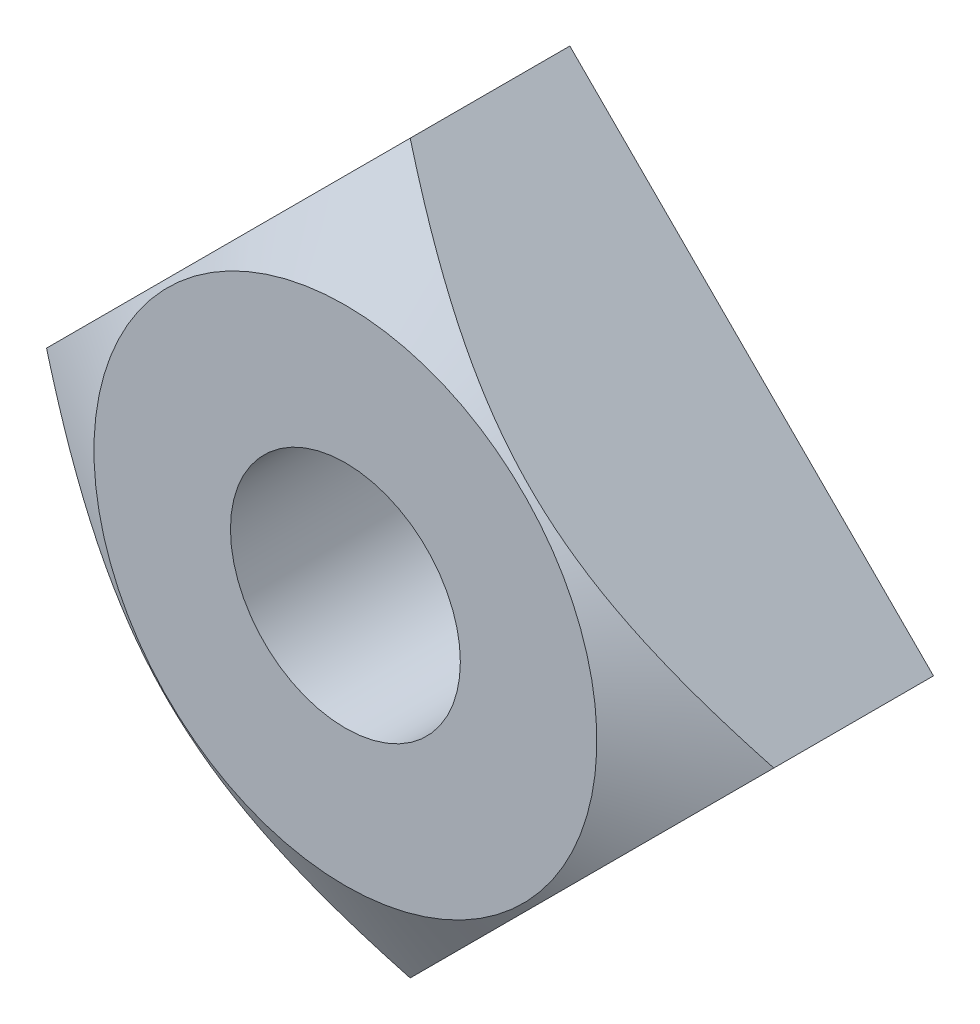
ISO-10303-21;
HEADER;
FILE_DESCRIPTION(('STEP AP214'),'2;1');
FILE_NAME('part.step','',(''),(''),'','','');
FILE_SCHEMA(('AUTOMOTIVE_DESIGN { 1 0 10303 214 1 1 1 1 }'));
ENDSEC;
DATA;
#1=APPLICATION_CONTEXT('core data for automotive mechanical design processes');
#2=APPLICATION_PROTOCOL_DEFINITION('international standard','automotive_design',2000,#1);
#3=PRODUCT_CONTEXT('',#1,'mechanical');
#4=PRODUCT('Part','Part','',(#3));
#5=PRODUCT_RELATED_PRODUCT_CATEGORY('part','',(#4));
#6=PRODUCT_DEFINITION_FORMATION('','',#4);
#7=PRODUCT_DEFINITION_CONTEXT('part definition',#1,'design');
#8=PRODUCT_DEFINITION('design','',#6,#7);
#9=PRODUCT_DEFINITION_SHAPE('','',#8);
#10=(LENGTH_UNIT() NAMED_UNIT(*) SI_UNIT(.MILLI.,.METRE.));
#11=(NAMED_UNIT(*) PLANE_ANGLE_UNIT() SI_UNIT($,.RADIAN.));
#12=(NAMED_UNIT(*) SI_UNIT($,.STERADIAN.) SOLID_ANGLE_UNIT());
#13=UNCERTAINTY_MEASURE_WITH_UNIT(LENGTH_MEASURE(1.E-05),#10,'distance_accuracy_value','');
#14=(GEOMETRIC_REPRESENTATION_CONTEXT(3) GLOBAL_UNCERTAINTY_ASSIGNED_CONTEXT((#13)) GLOBAL_UNIT_ASSIGNED_CONTEXT((#10,
#11,#12)) REPRESENTATION_CONTEXT('',''));
#15=CARTESIAN_POINT('',(0.,0.,0.));
#16=DIRECTION('',(0.,0.,1.));
#17=DIRECTION('',(1.,0.,0.));
#18=AXIS2_PLACEMENT_3D('',#15,#16,#17);
#19=CARTESIAN_POINT('',(-3.88908729652602,0.,-2.4));
#20=DIRECTION('',(-0.707106781186546,-0.707106781186549,0.));
#21=DIRECTION('',(0.707106781186549,-0.707106781186546,0.));
#22=AXIS2_PLACEMENT_3D('',#19,#20,#21);
#23=PLANE('',#22);
#24=DIRECTION('',(0.,0.,1.));
#25=VECTOR('',#24,1.);
#26=CARTESIAN_POINT('',(0.,-3.889087296526,-2.4));
#27=LINE('',#26,#25);
#28=CARTESIAN_POINT('',(0.,-3.889087296526,-2.4));
#29=VERTEX_POINT('',#28);
#30=CARTESIAN_POINT('',(0.,-3.889087296526,-0.692820323027553));
#31=VERTEX_POINT('',#30);
#32=EDGE_CURVE('E41',#29,#31,#27,.T.);
#33=ORIENTED_EDGE('',*,*,#32,.T.);
#34=CARTESIAN_POINT('',(0.000199999999998822,-3.889287296526,-0.692935796050317));
#35=CARTESIAN_POINT('',(-0.0659263686429715,-3.82316092788303,-0.654769628254131));
#36=CARTESIAN_POINT('',(-0.132291660917733,-3.75679563560827,-0.617412156509894));
#37=CARTESIAN_POINT('',(-0.265593268659043,-3.62349402786696,-0.544697309160815));
#38=CARTESIAN_POINT('',(-0.332529774496878,-3.55655752202913,-0.509340632925875));
#39=CARTESIAN_POINT('',(-0.467435999372075,-3.42165129715393,-0.440826454762846));
#40=CARTESIAN_POINT('',(-0.535409545003979,-3.35367775152203,-0.407683866054667));
#41=CARTESIAN_POINT('',(-0.672030025548941,-3.21705727097707,-0.344360491034057));
#42=CARTESIAN_POINT('',(-0.740676902842445,-3.14841039368356,-0.3141794536811));
#43=CARTESIAN_POINT('',(-0.945414957981738,-2.94367233854427,-0.229918968836834));
#44=CARTESIAN_POINT('',(-1.08261385766827,-2.80647343885774,-0.180909473833818));
#45=CARTESIAN_POINT('',(-1.29029020865001,-2.598797087876,-0.121791602560178));
#46=CARTESIAN_POINT('',(-1.3597548746417,-2.52933242188431,-0.104495655400296));
#47=CARTESIAN_POINT('',(-1.49925722442029,-2.38983007210572,-0.0753343842892979));
#48=CARTESIAN_POINT('',(-1.56929484546832,-2.31979245105769,-0.0634684736385099));
#49=CARTESIAN_POINT('',(-1.69827950347153,-2.19080779305448,-0.0471473001294974));
#50=CARTESIAN_POINT('',(-1.75717029316965,-2.13191700335636,-0.0417984092220668));
#51=CARTESIAN_POINT('',(-1.87507521153319,-2.01401208499282,-0.0354548013045492));
#52=CARTESIAN_POINT('',(-1.9340893482994,-1.95499794822662,-0.0344603798756705));
#53=CARTESIAN_POINT('',(-2.05209242713156,-1.83699486939445,-0.0368650112980426));
#54=CARTESIAN_POINT('',(-2.11108135434689,-1.77800594217913,-0.0402655216107517));
#55=CARTESIAN_POINT('',(-2.22886166442294,-1.66022563210307,-0.0513371041161467));
#56=CARTESIAN_POINT('',(-2.2876530182561,-1.60143427826992,-0.0590087784115486));
#57=CARTESIAN_POINT('',(-2.46371017532186,-1.42537712120415,-0.0881039990611984));
#58=CARTESIAN_POINT('',(-2.5804869139795,-1.30860038254651,-0.115603056450006));
#59=CARTESIAN_POINT('',(-2.812052084313,-1.07703521221302,-0.18375123296372));
#60=CARTESIAN_POINT('',(-2.92684004800507,-0.962247248520943,-0.224403404067461));
#61=CARTESIAN_POINT('',(-3.11299498612288,-0.77609231040314,-0.29904165671441));
#62=CARTESIAN_POINT('',(-3.18496978573453,-0.704117510791484,-0.330074532880308));
#63=CARTESIAN_POINT('',(-3.32813756425119,-0.560949732274827,-0.395455515419264));
#64=CARTESIAN_POINT('',(-3.39933077088909,-0.489756525636931,-0.4298026259449));
#65=CARTESIAN_POINT('',(-3.54066156164199,-0.34842573488403,-0.501030636719829));
#66=CARTESIAN_POINT('',(-3.6108026950012,-0.278284601524821,-0.537897567925962));
#67=CARTESIAN_POINT('',(-3.75047934906175,-0.138607947464268,-0.613860197792175));
#68=CARTESIAN_POINT('',(-3.82001487653742,-0.0690724199886025,-0.652955871484478));
#69=CARTESIAN_POINT('',(-3.889287296526,0.000199999999981001,-0.692935796050317));
#70=B_SPLINE_CURVE_WITH_KNOTS('',3,(#34,#35,#36,#37,#38,#39,#40,#41,#42,#43,#44,#45,#46,#47,#48,
#49,#50,#51,#52,#53,#54,#55,#56,#57,#58,#59,#60,#61,#62,#63,#64,#65,#66,#67,#68,#69),
.UNSPECIFIED.,.F.,.F.,(4,2,2,2,2,2,2,2,2,2,2,2,2,2,2,2,2,4),(0.,0.3030217506998,
0.606148775336212,0.911145901019314,1.21611715077057,1.8156214916209,2.11474730017217,
2.41384078141336,2.66410107824203,2.91437836246599,3.16473866575139,3.41513427107661,
3.91665268935898,4.4182875608732,4.73747154706454,5.05655992306882,5.3740039933746,
5.69144450817053),.UNSPECIFIED.);
#71=CARTESIAN_POINT('',(-3.889087296526,0.,-0.692820323027553));
#72=VERTEX_POINT('',#71);
#73=EDGE_CURVE('E54',#31,#72,#70,.T.);
#74=ORIENTED_EDGE('',*,*,#73,.T.);
#75=DIRECTION('',(0.,0.,1.));
#76=VECTOR('',#75,1.);
#77=CARTESIAN_POINT('',(-3.88908729652602,0.,-2.4));
#78=LINE('',#77,#76);
#79=CARTESIAN_POINT('',(-3.88908729652602,0.,-2.4));
#80=VERTEX_POINT('',#79);
#81=EDGE_CURVE('E11',#80,#72,#78,.T.);
#82=ORIENTED_EDGE('',*,*,#81,.F.);
#83=DIRECTION('',(0.707106781186549,-0.707106781186546,0.));
#84=VECTOR('',#83,1.);
#85=CARTESIAN_POINT('',(-3.88908729652602,0.,-2.4));
#86=LINE('',#85,#84);
#87=EDGE_CURVE('E107',#80,#29,#86,.T.);
#88=ORIENTED_EDGE('',*,*,#87,.T.);
#89=EDGE_LOOP('',(#33,#74,#82,#88));
#90=FACE_BOUND('',#89,.T.);
#91=ADVANCED_FACE('F37',(#90),#23,.T.);
#92=CARTESIAN_POINT('',(-3.88908729652602,0.,-2.4));
#93=DIRECTION('',(-0.707106781186546,0.707106781186549,0.));
#94=DIRECTION('',(-0.707106781186549,-0.707106781186546,0.));
#95=AXIS2_PLACEMENT_3D('',#92,#93,#94);
#96=PLANE('',#95);
#97=ORIENTED_EDGE('',*,*,#81,.T.);
#98=CARTESIAN_POINT('',(-3.889287296526,-0.000199999999982893,-0.692935796050317));
#99=CARTESIAN_POINT('',(-3.82316092788303,0.0659263686429873,-0.654769628254131));
#100=CARTESIAN_POINT('',(-3.75679563560827,0.132291660917749,-0.617412156509894));
#101=CARTESIAN_POINT('',(-3.62349402786696,0.265593268659058,-0.544697309160815));
#102=CARTESIAN_POINT('',(-3.55655752202913,0.332529774496893,-0.509340632925875));
#103=CARTESIAN_POINT('',(-3.42165129715393,0.467435999372089,-0.440826454762846));
#104=CARTESIAN_POINT('',(-3.35367775152202,0.535409545003992,-0.407683866054667));
#105=CARTESIAN_POINT('',(-3.21705727097706,0.672030025548954,-0.344360491034057));
#106=CARTESIAN_POINT('',(-3.14841039368356,0.740676902842458,-0.3141794536811));
#107=CARTESIAN_POINT('',(-2.94367233854427,0.945414957981749,-0.229918968836833));
#108=CARTESIAN_POINT('',(-2.80647343885773,1.08261385766828,-0.180909473833818));
#109=CARTESIAN_POINT('',(-2.598797087876,1.29029020865002,-0.121791602560177));
#110=CARTESIAN_POINT('',(-2.5293324218843,1.35975487464171,-0.104495655400296));
#111=CARTESIAN_POINT('',(-2.38983007210572,1.4992572244203,-0.0753343842892976));
#112=CARTESIAN_POINT('',(-2.31979245105769,1.56929484546832,-0.0634684736385095));
#113=CARTESIAN_POINT('',(-2.19080779305447,1.69827950347154,-0.0471473001294972));
#114=CARTESIAN_POINT('',(-2.13191700335635,1.75717029316966,-0.0417984092220667));
#115=CARTESIAN_POINT('',(-2.01401208499281,1.8750752115332,-0.0354548013045489));
#116=CARTESIAN_POINT('',(-1.95499794822661,1.9340893482994,-0.0344603798756698));
#117=CARTESIAN_POINT('',(-1.83699486939444,2.05209242713157,-0.0368650112980418));
#118=CARTESIAN_POINT('',(-1.77800594217912,2.11108135434689,-0.0402655216107512));
#119=CARTESIAN_POINT('',(-1.66022563210307,2.22886166442294,-0.0513371041161462));
#120=CARTESIAN_POINT('',(-1.60143427826991,2.2876530182561,-0.0590087784115479));
#121=CARTESIAN_POINT('',(-1.42537712120414,2.46371017532187,-0.0881039990611972));
#122=CARTESIAN_POINT('',(-1.3086003825465,2.58048691397951,-0.115603056450005));
#123=CARTESIAN_POINT('',(-1.077035212213,2.812052084313,-0.183751232963719));
#124=CARTESIAN_POINT('',(-0.962247248520929,2.92684004800508,-0.22440340406746));
#125=CARTESIAN_POINT('',(-0.776092310403126,3.11299498612288,-0.299041656714409));
#126=CARTESIAN_POINT('',(-0.70411751079147,3.18496978573454,-0.330074532880307));
#127=CARTESIAN_POINT('',(-0.560949732274812,3.32813756425119,-0.395455515419264));
#128=CARTESIAN_POINT('',(-0.489756525636915,3.39933077088909,-0.429802625944899));
#129=CARTESIAN_POINT('',(-0.348425734884013,3.54066156164199,-0.501030636719829));
#130=CARTESIAN_POINT('',(-0.278284601524804,3.6108026950012,-0.537897567925962));
#131=CARTESIAN_POINT('',(-0.138607947464251,3.75047934906175,-0.613860197792175));
#132=CARTESIAN_POINT('',(-0.0690724199885851,3.82001487653742,-0.652955871484477));
#133=CARTESIAN_POINT('',(0.000199999999998877,3.889287296526,-0.692935796050317));
#134=B_SPLINE_CURVE_WITH_KNOTS('',3,(#98,#99,#100,#101,#102,#103,#104,#105,#106,#107,#108,#109,
#110,#111,#112,#113,#114,#115,#116,#117,#118,#119,#120,#121,#122,#123,#124,#125,#126,#127,#128,
#129,#130,#131,#132,#133),.UNSPECIFIED.,.F.,.F.,(4,2,2,2,2,2,2,2,2,2,2,2,2,2,2,2,2,4),(0.,
0.3030217506998,0.606148775336212,0.911145901019314,1.21611715077057,1.8156214916209,
2.11474730017217,2.41384078141336,2.66410107824203,2.91437836246599,3.16473866575138,
3.4151342710766,3.91665268935898,4.4182875608732,4.73747154706454,5.05655992306882,
5.3740039933746,5.69144450817053),.UNSPECIFIED.);
#135=CARTESIAN_POINT('',(0.,3.889087296526,-0.692820323027553));
#136=VERTEX_POINT('',#135);
#137=EDGE_CURVE('E93',#72,#136,#134,.T.);
#138=ORIENTED_EDGE('',*,*,#137,.T.);
#139=DIRECTION('',(0.,0.,1.));
#140=VECTOR('',#139,1.);
#141=CARTESIAN_POINT('',(0.,3.889087296526,-2.4));
#142=LINE('',#141,#140);
#143=CARTESIAN_POINT('',(0.,3.889087296526,-2.4));
#144=VERTEX_POINT('',#143);
#145=EDGE_CURVE('E46',#144,#136,#142,.T.);
#146=ORIENTED_EDGE('',*,*,#145,.F.);
#147=DIRECTION('',(-0.707106781186549,-0.707106781186546,0.));
#148=VECTOR('',#147,1.);
#149=CARTESIAN_POINT('',(-3.88908729652602,0.,-2.4));
#150=LINE('',#149,#148);
#151=EDGE_CURVE('E100',#144,#80,#150,.T.);
#152=ORIENTED_EDGE('',*,*,#151,.T.);
#153=EDGE_LOOP('',(#97,#138,#146,#152));
#154=FACE_BOUND('',#153,.T.);
#155=ADVANCED_FACE('F146',(#154),#96,.T.);
#156=CARTESIAN_POINT('',(3.88908729652602,0.,-2.4));
#157=DIRECTION('',(0.707106781186546,0.707106781186549,0.));
#158=DIRECTION('',(-0.707106781186549,0.707106781186546,0.));
#159=AXIS2_PLACEMENT_3D('',#156,#157,#158);
#160=PLANE('',#159);
#161=ORIENTED_EDGE('',*,*,#145,.T.);
#162=CARTESIAN_POINT('',(-0.000200000000001178,3.889287296526,-0.692935796050317));
#163=CARTESIAN_POINT('',(0.0659263686429692,3.82316092788303,-0.654769628254132));
#164=CARTESIAN_POINT('',(0.132291660917731,3.75679563560827,-0.617412156509895));
#165=CARTESIAN_POINT('',(0.265593268659041,3.62349402786696,-0.544697309160815));
#166=CARTESIAN_POINT('',(0.332529774496876,3.55655752202913,-0.509340632925875));
#167=CARTESIAN_POINT('',(0.467435999372074,3.42165129715393,-0.440826454762846));
#168=CARTESIAN_POINT('',(0.535409545003977,3.35367775152203,-0.407683866054667));
#169=CARTESIAN_POINT('',(0.672030025548939,3.21705727097707,-0.344360491034057));
#170=CARTESIAN_POINT('',(0.740676902842443,3.14841039368356,-0.3141794536811));
#171=CARTESIAN_POINT('',(0.945414957981735,2.94367233854427,-0.229918968836833));
#172=CARTESIAN_POINT('',(1.08261385766827,2.80647343885774,-0.180909473833818));
#173=CARTESIAN_POINT('',(1.29029020865,2.598797087876,-0.121791602560178));
#174=CARTESIAN_POINT('',(1.3597548746417,2.52933242188431,-0.104495655400296));
#175=CARTESIAN_POINT('',(1.49925722442028,2.38983007210572,-0.0753343842892978));
#176=CARTESIAN_POINT('',(1.56929484546831,2.3197924510577,-0.0634684736385095));
#177=CARTESIAN_POINT('',(1.69827950347153,2.19080779305448,-0.047147300129497));
#178=CARTESIAN_POINT('',(1.75717029316965,2.13191700335636,-0.0417984092220665));
#179=CARTESIAN_POINT('',(1.87507521153319,2.01401208499282,-0.0354548013045488));
#180=CARTESIAN_POINT('',(1.93408934829939,1.95499794822662,-0.0344603798756698));
#181=CARTESIAN_POINT('',(2.05209242713156,1.83699486939445,-0.0368650112980416));
#182=CARTESIAN_POINT('',(2.11108135434688,1.77800594217913,-0.0402655216107508));
#183=CARTESIAN_POINT('',(2.22886166442294,1.66022563210308,-0.0513371041161456));
#184=CARTESIAN_POINT('',(2.28765301825609,1.60143427826992,-0.0590087784115474));
#185=CARTESIAN_POINT('',(2.46371017532186,1.42537712120415,-0.0881039990611968));
#186=CARTESIAN_POINT('',(2.5804869139795,1.30860038254651,-0.115603056450005));
#187=CARTESIAN_POINT('',(2.812052084313,1.07703521221302,-0.183751232963719));
#188=CARTESIAN_POINT('',(2.92684004800507,0.962247248520943,-0.224403404067459));
#189=CARTESIAN_POINT('',(3.11299498612288,0.776092310403141,-0.299041656714409));
#190=CARTESIAN_POINT('',(3.18496978573453,0.704117510791485,-0.330074532880307));
#191=CARTESIAN_POINT('',(3.32813756425119,0.560949732274827,-0.395455515419264));
#192=CARTESIAN_POINT('',(3.39933077088909,0.489756525636931,-0.429802625944899));
#193=CARTESIAN_POINT('',(3.54066156164199,0.348425734884029,-0.501030636719828));
#194=CARTESIAN_POINT('',(3.6108026950012,0.27828460152482,-0.537897567925962));
#195=CARTESIAN_POINT('',(3.75047934906175,0.138607947464267,-0.613860197792175));
#196=CARTESIAN_POINT('',(3.82001487653742,0.0690724199886007,-0.652955871484478));
#197=CARTESIAN_POINT('',(3.889287296526,-0.000199999999983013,-0.692935796050317));
#198=B_SPLINE_CURVE_WITH_KNOTS('',3,(#162,#163,#164,#165,#166,#167,#168,#169,#170,#171,#172,
#173,#174,#175,#176,#177,#178,#179,#180,#181,#182,#183,#184,#185,#186,#187,#188,#189,#190,#191,
#192,#193,#194,#195,#196,#197),.UNSPECIFIED.,.F.,.F.,(4,2,2,2,2,2,2,2,2,2,2,2,2,2,2,2,2,4),(0.,
0.3030217506998,0.606148775336213,0.911145901019314,1.21611715077057,1.8156214916209,
2.11474730017217,2.41384078141336,2.66410107824203,2.91437836246599,3.16473866575138,
3.4151342710766,3.91665268935898,4.4182875608732,4.73747154706454,5.05655992306882,
5.37400399337461,5.69144450817053),.UNSPECIFIED.);
#199=CARTESIAN_POINT('',(3.889087296526,0.,-0.692820323027553));
#200=VERTEX_POINT('',#199);
#201=EDGE_CURVE('E80',#136,#200,#198,.T.);
#202=ORIENTED_EDGE('',*,*,#201,.T.);
#203=DIRECTION('',(0.,0.,1.));
#204=VECTOR('',#203,1.);
#205=CARTESIAN_POINT('',(3.88908729652602,0.,-2.4));
#206=LINE('',#205,#204);
#207=CARTESIAN_POINT('',(3.88908729652602,0.,-2.4));
#208=VERTEX_POINT('',#207);
#209=EDGE_CURVE('E91',#208,#200,#206,.T.);
#210=ORIENTED_EDGE('',*,*,#209,.F.);
#211=DIRECTION('',(-0.707106781186549,0.707106781186546,0.));
#212=VECTOR('',#211,1.);
#213=CARTESIAN_POINT('',(3.88908729652602,0.,-2.4));
#214=LINE('',#213,#212);
#215=EDGE_CURVE('E104',#208,#144,#214,.T.);
#216=ORIENTED_EDGE('',*,*,#215,.T.);
#217=EDGE_LOOP('',(#161,#202,#210,#216));
#218=FACE_BOUND('',#217,.T.);
#219=ADVANCED_FACE('F89',(#218),#160,.T.);
#220=CARTESIAN_POINT('',(3.88908729652602,0.,-2.4));
#221=DIRECTION('',(0.707106781186546,-0.707106781186549,0.));
#222=DIRECTION('',(0.707106781186549,0.707106781186546,0.));
#223=AXIS2_PLACEMENT_3D('',#220,#221,#222);
#224=PLANE('',#223);
#225=ORIENTED_EDGE('',*,*,#209,.T.);
#226=CARTESIAN_POINT('',(3.889287296526,0.000199999999982765,-0.692935796050317));
#227=CARTESIAN_POINT('',(3.82316092788303,-0.0659263686429874,-0.654769628254131));
#228=CARTESIAN_POINT('',(3.75679563560827,-0.132291660917749,-0.617412156509894));
#229=CARTESIAN_POINT('',(3.62349402786696,-0.265593268659058,-0.544697309160815));
#230=CARTESIAN_POINT('',(3.55655752202913,-0.332529774496893,-0.509340632925875));
#231=CARTESIAN_POINT('',(3.42165129715393,-0.46743599937209,-0.440826454762846));
#232=CARTESIAN_POINT('',(3.35367775152202,-0.535409545003993,-0.407683866054667));
#233=CARTESIAN_POINT('',(3.21705727097706,-0.672030025548954,-0.344360491034057));
#234=CARTESIAN_POINT('',(3.14841039368356,-0.740676902842458,-0.3141794536811));
#235=CARTESIAN_POINT('',(2.94367233854427,-0.94541495798175,-0.229918968836833));
#236=CARTESIAN_POINT('',(2.80647343885773,-1.08261385766828,-0.180909473833818));
#237=CARTESIAN_POINT('',(2.598797087876,-1.29029020865002,-0.121791602560177));
#238=CARTESIAN_POINT('',(2.5293324218843,-1.35975487464171,-0.104495655400295));
#239=CARTESIAN_POINT('',(2.38983007210572,-1.4992572244203,-0.0753343842892972));
#240=CARTESIAN_POINT('',(2.31979245105769,-1.56929484546832,-0.0634684736385092));
#241=CARTESIAN_POINT('',(2.19080779305447,-1.69827950347154,-0.0471473001294969));
#242=CARTESIAN_POINT('',(2.13191700335635,-1.75717029316966,-0.0417984092220664));
#243=CARTESIAN_POINT('',(2.01401208499281,-1.8750752115332,-0.0354548013045486));
#244=CARTESIAN_POINT('',(1.95499794822661,-1.9340893482994,-0.0344603798756696));
#245=CARTESIAN_POINT('',(1.83699486939444,-2.05209242713157,-0.0368650112980415));
#246=CARTESIAN_POINT('',(1.77800594217912,-2.11108135434689,-0.0402655216107507));
#247=CARTESIAN_POINT('',(1.66022563210307,-2.22886166442294,-0.0513371041161457));
#248=CARTESIAN_POINT('',(1.60143427826991,-2.2876530182561,-0.0590087784115475));
#249=CARTESIAN_POINT('',(1.42537712120414,-2.46371017532187,-0.088103999061197));
#250=CARTESIAN_POINT('',(1.3086003825465,-2.58048691397951,-0.115603056450005));
#251=CARTESIAN_POINT('',(1.07703521221301,-2.812052084313,-0.183751232963719));
#252=CARTESIAN_POINT('',(0.96224724852093,-2.92684004800508,-0.224403404067459));
#253=CARTESIAN_POINT('',(0.776092310403126,-3.11299498612288,-0.299041656714409));
#254=CARTESIAN_POINT('',(0.70411751079147,-3.18496978573453,-0.330074532880307));
#255=CARTESIAN_POINT('',(0.560949732274812,-3.32813756425119,-0.395455515419264));
#256=CARTESIAN_POINT('',(0.489756525636915,-3.39933077088909,-0.429802625944899));
#257=CARTESIAN_POINT('',(0.348425734884012,-3.54066156164199,-0.501030636719829));
#258=CARTESIAN_POINT('',(0.278284601524803,-3.6108026950012,-0.537897567925962));
#259=CARTESIAN_POINT('',(0.138607947464249,-3.75047934906175,-0.613860197792175));
#260=CARTESIAN_POINT('',(0.0690724199885829,-3.82001487653742,-0.652955871484478));
#261=CARTESIAN_POINT('',(-0.000200000000001118,-3.889287296526,-0.692935796050318));
#262=B_SPLINE_CURVE_WITH_KNOTS('',3,(#226,#227,#228,#229,#230,#231,#232,#233,#234,#235,#236,
#237,#238,#239,#240,#241,#242,#243,#244,#245,#246,#247,#248,#249,#250,#251,#252,#253,#254,#255,
#256,#257,#258,#259,#260,#261),.UNSPECIFIED.,.F.,.F.,(4,2,2,2,2,2,2,2,2,2,2,2,2,2,2,2,2,4),(0.,
0.3030217506998,0.606148775336212,0.911145901019314,1.21611715077057,1.8156214916209,
2.11474730017217,2.41384078141336,2.66410107824203,2.91437836246599,3.16473866575138,
3.4151342710766,3.91665268935897,4.4182875608732,4.73747154706454,5.05655992306882,
5.3740039933746,5.69144450817053),.UNSPECIFIED.);
#263=EDGE_CURVE('E76',#200,#31,#262,.T.);
#264=ORIENTED_EDGE('',*,*,#263,.T.);
#265=ORIENTED_EDGE('',*,*,#32,.F.);
#266=DIRECTION('',(0.707106781186549,0.707106781186546,0.));
#267=VECTOR('',#266,1.);
#268=CARTESIAN_POINT('',(3.88908729652602,0.,-2.4));
#269=LINE('',#268,#267);
#270=EDGE_CURVE('E98',#29,#208,#269,.T.);
#271=ORIENTED_EDGE('',*,*,#270,.T.);
#272=EDGE_LOOP('',(#225,#264,#265,#271));
#273=FACE_BOUND('',#272,.T.);
#274=ADVANCED_FACE('F96',(#273),#224,.T.);
#275=CARTESIAN_POINT('',(0.,-3.889087296526,0.));
#276=DIRECTION('',(0.,0.,-1.));
#277=DIRECTION('',(-1.,0.,0.));
#278=AXIS2_PLACEMENT_3D('',#275,#276,#277);
#279=PLANE('',#278);
#280=CARTESIAN_POINT('',(0.,0.,0.));
#281=DIRECTION('',(0.,0.,1.));
#282=DIRECTION('',(1.,0.,0.));
#283=AXIS2_PLACEMENT_3D('',#280,#281,#282);
#284=CIRCLE('',#283,1.229375);
#285=CARTESIAN_POINT('',(1.229375,0.,0.));
#286=VERTEX_POINT('',#285);
#287=EDGE_CURVE('E110',#286,#286,#284,.T.);
#288=ORIENTED_EDGE('',*,*,#287,.F.);
#289=EDGE_LOOP('',(#288));
#290=FACE_BOUND('',#289,.T.);
#291=CARTESIAN_POINT('',(0.,0.,0.));
#292=DIRECTION('',(0.,0.,1.));
#293=DIRECTION('',(0.,-1.,0.));
#294=AXIS2_PLACEMENT_3D('',#291,#292,#293);
#295=CIRCLE('',#294,2.689087296526);
#296=CARTESIAN_POINT('',(0.,-2.689087296526,0.));
#297=VERTEX_POINT('',#296);
#298=EDGE_CURVE('E85',#297,#297,#295,.T.);
#299=ORIENTED_EDGE('',*,*,#298,.T.);
#300=EDGE_LOOP('',(#299));
#301=FACE_BOUND('',#300,.T.);
#302=ADVANCED_FACE('F151',(#290,#301),#279,.F.);
#303=CARTESIAN_POINT('',(0.,-3.889087296526,-2.4));
#304=DIRECTION('',(0.,0.,-1.));
#305=DIRECTION('',(-1.,0.,0.));
#306=AXIS2_PLACEMENT_3D('',#303,#304,#305);
#307=PLANE('',#306);
#308=CARTESIAN_POINT('',(0.,0.,-2.4));
#309=DIRECTION('',(0.,0.,1.));
#310=DIRECTION('',(1.,0.,0.));
#311=AXIS2_PLACEMENT_3D('',#308,#309,#310);
#312=CIRCLE('',#311,1.229375);
#313=CARTESIAN_POINT('',(1.229375,0.,-2.4));
#314=VERTEX_POINT('',#313);
#315=EDGE_CURVE('E109',#314,#314,#312,.T.);
#316=ORIENTED_EDGE('',*,*,#315,.T.);
#317=EDGE_LOOP('',(#316));
#318=FACE_BOUND('',#317,.T.);
#319=ORIENTED_EDGE('',*,*,#87,.F.);
#320=ORIENTED_EDGE('',*,*,#151,.F.);
#321=ORIENTED_EDGE('',*,*,#215,.F.);
#322=ORIENTED_EDGE('',*,*,#270,.F.);
#323=EDGE_LOOP('',(#319,#320,#321,#322));
#324=FACE_BOUND('',#323,.T.);
#325=ADVANCED_FACE('F155',(#318,#324),#307,.T.);
#326=CARTESIAN_POINT('',(0.,0.,-2.4));
#327=DIRECTION('',(0.,0.,1.));
#328=DIRECTION('',(1.,0.,0.));
#329=AXIS2_PLACEMENT_3D('',#326,#327,#328);
#330=CYLINDRICAL_SURFACE('',#329,1.229375);
#331=ORIENTED_EDGE('',*,*,#315,.F.);
#332=EDGE_LOOP('',(#331));
#333=FACE_BOUND('',#332,.T.);
#334=ORIENTED_EDGE('',*,*,#287,.T.);
#335=EDGE_LOOP('',(#334));
#336=FACE_BOUND('',#335,.T.);
#337=ADVANCED_FACE('F129',(#333,#336),#330,.F.);
#338=CARTESIAN_POINT('',(0.,0.,0.));
#339=DIRECTION('',(0.,0.,-1.));
#340=DIRECTION('',(0.,1.,0.));
#341=AXIS2_PLACEMENT_3D('',#338,#339,#340);
#342=CONICAL_SURFACE('',#341,2.689087296526,1.0471975511966);
#343=ORIENTED_EDGE('',*,*,#263,.F.);
#344=ORIENTED_EDGE('',*,*,#201,.F.);
#345=ORIENTED_EDGE('',*,*,#137,.F.);
#346=ORIENTED_EDGE('',*,*,#73,.F.);
#347=EDGE_LOOP('',(#343,#344,#345,#346));
#348=FACE_BOUND('',#347,.T.);
#349=ORIENTED_EDGE('',*,*,#298,.F.);
#350=EDGE_LOOP('',(#349));
#351=FACE_BOUND('',#350,.T.);
#352=ADVANCED_FACE('F78',(#348,#351),#342,.T.);
#353=CLOSED_SHELL('',(#91,#155,#219,#274,#302,#325,#337,#352));
#354=MANIFOLD_SOLID_BREP('B2',#353);
#355=ADVANCED_BREP_SHAPE_REPRESENTATION('',(#18,#354),#14);
#356=SHAPE_DEFINITION_REPRESENTATION(#9,#355);
ENDSEC;
END-ISO-10303-21;
